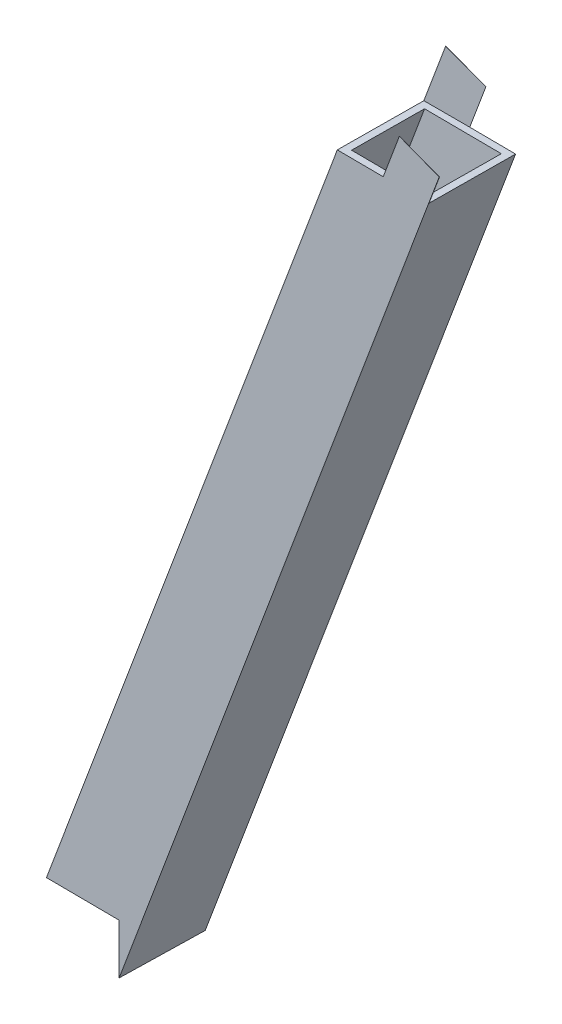
ISO-10303-21;
HEADER;
FILE_DESCRIPTION(('STEP AP214'),'2;1');
FILE_NAME('part.step','',(''),(''),'','','');
FILE_SCHEMA(('AUTOMOTIVE_DESIGN { 1 0 10303 214 1 1 1 1 }'));
ENDSEC;
DATA;
#1=APPLICATION_CONTEXT('core data for automotive mechanical design processes');
#2=APPLICATION_PROTOCOL_DEFINITION('international standard','automotive_design',2000,#1);
#3=PRODUCT_CONTEXT('',#1,'mechanical');
#4=PRODUCT('Part','Part','',(#3));
#5=PRODUCT_RELATED_PRODUCT_CATEGORY('part','',(#4));
#6=PRODUCT_DEFINITION_FORMATION('','',#4);
#7=PRODUCT_DEFINITION_CONTEXT('part definition',#1,'design');
#8=PRODUCT_DEFINITION('design','',#6,#7);
#9=PRODUCT_DEFINITION_SHAPE('','',#8);
#10=(LENGTH_UNIT() NAMED_UNIT(*) SI_UNIT(.MILLI.,.METRE.));
#11=(NAMED_UNIT(*) PLANE_ANGLE_UNIT() SI_UNIT($,.RADIAN.));
#12=(NAMED_UNIT(*) SI_UNIT($,.STERADIAN.) SOLID_ANGLE_UNIT());
#13=UNCERTAINTY_MEASURE_WITH_UNIT(LENGTH_MEASURE(1.E-05),#10,'distance_accuracy_value','');
#14=(GEOMETRIC_REPRESENTATION_CONTEXT(3) GLOBAL_UNCERTAINTY_ASSIGNED_CONTEXT((#13)) GLOBAL_UNIT_ASSIGNED_CONTEXT((#10,
#11,#12)) REPRESENTATION_CONTEXT('',''));
#15=CARTESIAN_POINT('',(0.,0.,0.));
#16=DIRECTION('',(0.,0.,1.));
#17=DIRECTION('',(1.,0.,0.));
#18=AXIS2_PLACEMENT_3D('',#15,#16,#17);
#19=CARTESIAN_POINT('',(232.803986578349,197.073505033119,-441.535165642863));
#20=DIRECTION('',(0.00725504842420271,-0.00272064315907602,-0.999969980736004));
#21=DIRECTION('',(-0.999973681595048,0.,-0.00725507527492033));
#22=AXIS2_PLACEMENT_3D('',#19,#20,#21);
#23=PLANE('',#22);
#24=DIRECTION('',(0.,0.999996298848739,-0.0027207147634189));
#25=VECTOR('',#24,1.);
#26=CARTESIAN_POINT('',(160.,197.072067923423,-442.063374037529));
#27=LINE('',#26,#25);
#28=CARTESIAN_POINT('',(160.,2.929540824187,-441.535165642863));
#29=VERTEX_POINT('',#28);
#30=CARTESIAN_POINT('',(160.,10.,-441.554402416725));
#31=VERTEX_POINT('',#30);
#32=EDGE_CURVE('E177',#29,#31,#27,.T.);
#33=ORIENTED_EDGE('',*,*,#32,.T.);
#34=DIRECTION('',(-0.999973681595048,0.,-0.00725507527492033));
#35=VECTOR('',#34,1.);
#36=CARTESIAN_POINT('',(232.800294019745,10.,-441.026216902576));
#37=LINE('',#36,#35);
#38=CARTESIAN_POINT('',(144.709552943641,10.,-441.665338680772));
#39=VERTEX_POINT('',#38);
#40=EDGE_CURVE('E180',#31,#39,#37,.T.);
#41=ORIENTED_EDGE('',*,*,#40,.T.);
#42=DIRECTION('',(-0.351123441588392,-0.936329177569044,0.));
#43=VECTOR('',#42,1.);
#44=CARTESIAN_POINT('',(217.074128608124,202.972201771954,-441.665338680772));
#45=LINE('',#44,#43);
#46=CARTESIAN_POINT('',(212.209552943641,190.,-441.665338680772));
#47=VERTEX_POINT('',#46);
#48=EDGE_CURVE('E45',#47,#39,#45,.T.);
#49=ORIENTED_EDGE('',*,*,#48,.F.);
#50=DIRECTION('',(0.999973681595048,0.,0.00725507527492033));
#51=VECTOR('',#50,1.);
#52=CARTESIAN_POINT('',(232.803846957659,190.,-441.515921595047));
#53=LINE('',#52,#51);
#54=CARTESIAN_POINT('',(230.15142219093,190.,-441.535165642863));
#55=VERTEX_POINT('',#54);
#56=EDGE_CURVE('E200',#47,#55,#53,.T.);
#57=ORIENTED_EDGE('',*,*,#56,.T.);
#58=DIRECTION('',(-0.351123441588392,-0.936329177569044,0.));
#59=VECTOR('',#58,1.);
#60=CARTESIAN_POINT('',(232.803986578349,197.073505033119,-441.535165642863));
#61=LINE('',#60,#59);
#62=EDGE_CURVE('E235',#55,#29,#61,.T.);
#63=ORIENTED_EDGE('',*,*,#62,.T.);
#64=EDGE_LOOP('',(#33,#41,#49,#57,#63));
#65=FACE_BOUND('',#64,.T.);
#66=ADVANCED_FACE('F41',(#65),#23,.T.);
#67=CARTESIAN_POINT('',(217.19601342165,202.926494966881,-458.464834357137));
#68=DIRECTION('',(0.936301069656275,-0.351112901121104,0.00774839511359631));
#69=DIRECTION('',(0.351123441588392,0.936329177569045,0.));
#70=AXIS2_PLACEMENT_3D('',#67,#68,#69);
#71=PLANE('',#70);
#72=ORIENTED_EDGE('',*,*,#48,.T.);
#73=DIRECTION('',(0.00827525467579562,0.,-0.999965759493819));
#74=VECTOR('',#73,1.);
#75=CARTESIAN_POINT('',(144.853532149881,10.,-459.063507312405));
#76=LINE('',#75,#74);
#77=CARTESIAN_POINT('',(144.84857780907,10.,-458.464834357137));
#78=VERTEX_POINT('',#77);
#79=EDGE_CURVE('E201',#39,#78,#76,.T.);
#80=ORIENTED_EDGE('',*,*,#79,.T.);
#81=DIRECTION('',(-0.351123441588392,-0.936329177569044,0.));
#82=VECTOR('',#81,1.);
#83=CARTESIAN_POINT('',(217.19601342165,202.926494966881,-458.464834357137));
#84=LINE('',#83,#82);
#85=CARTESIAN_POINT('',(212.348577809098,190.,-458.464834357137));
#86=VERTEX_POINT('',#85);
#87=EDGE_CURVE('E207',#86,#78,#84,.T.);
#88=ORIENTED_EDGE('',*,*,#87,.F.);
#89=DIRECTION('',(-0.00827525467579562,0.,0.999965759493819));
#90=VECTOR('',#89,1.);
#91=CARTESIAN_POINT('',(212.348909760685,190.,-458.50494674784));
#92=LINE('',#91,#90);
#93=EDGE_CURVE('E204',#86,#47,#92,.T.);
#94=ORIENTED_EDGE('',*,*,#93,.T.);
#95=EDGE_LOOP('',(#72,#80,#88,#94));
#96=FACE_BOUND('',#95,.T.);
#97=ADVANCED_FACE('F294',(#96),#71,.T.);
#98=CARTESIAN_POINT('',(232.925871391876,197.027798228047,-458.334661319229));
#99=DIRECTION('',(-0.00725504842420271,0.00272064315907602,0.999969980736004));
#100=DIRECTION('',(0.999973681595048,0.,0.00725507527492033));
#101=AXIS2_PLACEMENT_3D('',#98,#99,#100);
#102=PLANE('',#101);
#103=ORIENTED_EDGE('',*,*,#87,.T.);
#104=DIRECTION('',(0.999973681595048,0.,0.00725507527492033));
#105=VECTOR('',#104,1.);
#106=CARTESIAN_POINT('',(232.922179735458,10.,-457.825836928035));
#107=LINE('',#106,#105);
#108=CARTESIAN_POINT('',(160.,10.,-458.354906755501));
#109=VERTEX_POINT('',#108);
#110=EDGE_CURVE('E176',#78,#109,#107,.T.);
#111=ORIENTED_EDGE('',*,*,#110,.T.);
#112=DIRECTION('',(0.,-0.999996298848739,0.0027207147634189));
#113=VECTOR('',#112,1.);
#114=CARTESIAN_POINT('',(160.,197.026358712413,-458.863754014119));
#115=LINE('',#114,#113);
#116=CARTESIAN_POINT('',(160.,2.55880784971065,-458.334661319229));
#117=VERTEX_POINT('',#116);
#118=EDGE_CURVE('E172',#109,#117,#115,.T.);
#119=ORIENTED_EDGE('',*,*,#118,.T.);
#120=DIRECTION('',(-0.351123441588392,-0.936329177569044,0.));
#121=VECTOR('',#120,1.);
#122=CARTESIAN_POINT('',(232.925871391876,197.027798228047,-458.334661319229));
#123=LINE('',#122,#121);
#124=CARTESIAN_POINT('',(230.290447056358,190.,-458.334661319229));
#125=VERTEX_POINT('',#124);
#126=EDGE_CURVE('E193',#125,#117,#123,.T.);
#127=ORIENTED_EDGE('',*,*,#126,.F.);
#128=DIRECTION('',(-0.999973681595048,0.,-0.00725507527492033));
#129=VECTOR('',#128,1.);
#130=CARTESIAN_POINT('',(232.925732673372,190.,-458.315541620506));
#131=LINE('',#130,#129);
#132=EDGE_CURVE('E175',#125,#86,#131,.T.);
#133=ORIENTED_EDGE('',*,*,#132,.T.);
#134=EDGE_LOOP('',(#103,#111,#119,#127,#133));
#135=FACE_BOUND('',#134,.T.);
#136=ADVANCED_FACE('F300',(#135),#102,.T.);
#137=CARTESIAN_POINT('',(234.435561180805,196.461664557198,-459.922215856224));
#138=DIRECTION('',(-0.00725504842418489,0.00272064315906934,0.999969980736004));
#139=DIRECTION('',(0.999973681595049,0.,0.00725507527490251));
#140=AXIS2_PLACEMENT_3D('',#137,#138,#139);
#141=PLANE('',#140);
#142=DIRECTION('',(0.999973681595049,0.,0.00725507527490251));
#143=VECTOR('',#142,1.);
#144=CARTESIAN_POINT('',(234.431880699041,10.,-459.414931677894));
#145=LINE('',#144,#143);
#146=CARTESIAN_POINT('',(143.153068820321,10.,-460.077183758496));
#147=VERTEX_POINT('',#146);
#148=CARTESIAN_POINT('',(160.,10.,-459.954954787765));
#149=VERTEX_POINT('',#148);
#150=EDGE_CURVE('E51',#147,#149,#145,.T.);
#151=ORIENTED_EDGE('',*,*,#150,.F.);
#152=DIRECTION('',(-0.351123441588392,-0.936329177569044,0.));
#153=VECTOR('',#152,1.);
#154=CARTESIAN_POINT('',(215.709539787679,203.48392257962,-460.077183758496));
#155=LINE('',#154,#153);
#156=CARTESIAN_POINT('',(215.709539787679,203.48392257962,-460.077183758496));
#157=VERTEX_POINT('',#156);
#158=EDGE_CURVE('E220',#157,#147,#155,.T.);
#159=ORIENTED_EDGE('',*,*,#158,.F.);
#160=DIRECTION('',(-0.936301069656276,0.351112901121104,-0.00774839511358697));
#161=VECTOR('',#160,1.);
#162=CARTESIAN_POINT('',(234.435561180805,196.461664557198,-459.922215856224));
#163=LINE('',#162,#161);
#164=CARTESIAN_POINT('',(225.036275786601,199.986396580025,-460.));
#165=VERTEX_POINT('',#164);
#166=EDGE_CURVE('E217',#165,#157,#163,.T.);
#167=ORIENTED_EDGE('',*,*,#166,.F.);
#168=DIRECTION('',(0.351123441588392,0.936329177569044,0.));
#169=VECTOR('',#168,1.);
#170=CARTESIAN_POINT('',(225.036275786598,199.986396580026,-460.));
#171=LINE('',#170,#169);
#172=CARTESIAN_POINT('',(221.291377069089,190.,-460.));
#173=VERTEX_POINT('',#172);
#174=EDGE_CURVE('E155',#173,#165,#171,.T.);
#175=ORIENTED_EDGE('',*,*,#174,.F.);
#176=DIRECTION('',(-0.999973681595049,0.,-0.00725507527490251));
#177=VECTOR('',#176,1.);
#178=CARTESIAN_POINT('',(234.435433636955,190.,-459.904636370364));
#179=LINE('',#178,#177);
#180=CARTESIAN_POINT('',(232.01243697185,190.,-459.922215856224));
#181=VERTEX_POINT('',#180);
#182=EDGE_CURVE('E165',#181,#173,#179,.T.);
#183=ORIENTED_EDGE('',*,*,#182,.F.);
#184=DIRECTION('',(-0.351123441588392,-0.936329177569044,0.));
#185=VECTOR('',#184,1.);
#186=CARTESIAN_POINT('',(234.435561180805,196.461664557198,-459.922215856224));
#187=LINE('',#186,#185);
#188=CARTESIAN_POINT('',(160.,-2.03316525828102,-459.922215856224));
#189=VERTEX_POINT('',#188);
#190=EDGE_CURVE('E164',#181,#189,#187,.T.);
#191=ORIENTED_EDGE('',*,*,#190,.T.);
#192=DIRECTION('',(0.,-0.999996298848739,0.00272071476341222));
#193=VECTOR('',#192,1.);
#194=CARTESIAN_POINT('',(160.,196.460195241138,-460.462261671366));
#195=LINE('',#194,#193);
#196=EDGE_CURVE('E187',#149,#189,#195,.T.);
#197=ORIENTED_EDGE('',*,*,#196,.F.);
#198=EDGE_LOOP('',(#151,#159,#167,#175,#183,#191,#197));
#199=FACE_BOUND('',#198,.T.);
#200=ADVANCED_FACE('F267',(#199),#141,.F.);
#201=CARTESIAN_POINT('',(215.709539787679,203.48392257962,-460.077183758496));
#202=DIRECTION('',(0.936301069656275,-0.351112901121104,0.00774839511359747));
#203=DIRECTION('',(0.351123441588392,0.936329177569045,0.));
#204=AXIS2_PLACEMENT_3D('',#201,#202,#203);
#205=PLANE('',#204);
#206=DIRECTION('',(0.00827525467579686,0.,-0.999965759493819));
#207=VECTOR('',#206,1.);
#208=CARTESIAN_POINT('',(143.158037475841,10.,-460.677586475331));
#209=LINE('',#208,#207);
#210=CARTESIAN_POINT('',(142.987563028144,10.,-440.077784143776));
#211=VERTEX_POINT('',#210);
#212=EDGE_CURVE('E132',#211,#147,#209,.T.);
#213=ORIENTED_EDGE('',*,*,#212,.F.);
#214=DIRECTION('',(-0.351123441588392,-0.936329177569044,0.));
#215=VECTOR('',#214,1.);
#216=CARTESIAN_POINT('',(215.564438819195,203.538335442802,-440.077784143776));
#217=LINE('',#216,#215);
#218=CARTESIAN_POINT('',(210.487563028129,190.,-440.077784143776));
#219=VERTEX_POINT('',#218);
#220=EDGE_CURVE('E218',#219,#211,#217,.T.);
#221=ORIENTED_EDGE('',*,*,#220,.F.);
#222=DIRECTION('',(-0.00827525467579686,0.,0.999965759493819));
#223=VECTOR('',#222,1.);
#224=CARTESIAN_POINT('',(210.653415086644,190.,-460.119025910766));
#225=LINE('',#224,#223);
#226=CARTESIAN_POINT('',(210.652430083192,190.,-460.));
#227=VERTEX_POINT('',#226);
#228=EDGE_CURVE('E237',#227,#219,#225,.T.);
#229=ORIENTED_EDGE('',*,*,#228,.F.);
#230=DIRECTION('',(-0.351123441588392,-0.936329177569045,0.));
#231=VECTOR('',#230,1.);
#232=CARTESIAN_POINT('',(215.708979798963,203.484132575389,-460.));
#233=LINE('',#232,#231);
#234=CARTESIAN_POINT('',(215.708979798963,203.484132575389,-460.));
#235=VERTEX_POINT('',#234);
#236=EDGE_CURVE('E125',#235,#227,#233,.T.);
#237=ORIENTED_EDGE('',*,*,#236,.F.);
#238=DIRECTION('',(-0.00725504842419483,0.00272064315907273,0.999969980736004));
#239=VECTOR('',#238,1.);
#240=CARTESIAN_POINT('',(215.709539787679,203.48392257962,-460.077183758496));
#241=LINE('',#240,#239);
#242=EDGE_CURVE('E245',#157,#235,#241,.T.);
#243=ORIENTED_EDGE('',*,*,#242,.F.);
#244=ORIENTED_EDGE('',*,*,#158,.T.);
#245=EDGE_LOOP('',(#213,#221,#229,#237,#243,#244));
#246=FACE_BOUND('',#245,.T.);
#247=ADVANCED_FACE('F270',(#246),#205,.F.);
#248=CARTESIAN_POINT('',(234.290460212321,196.51607742038,-439.922816241504));
#249=DIRECTION('',(0.00725504842418489,-0.00272064315906934,-0.999969980736004));
#250=DIRECTION('',(-0.999973681595049,0.,-0.00725507527490251));
#251=AXIS2_PLACEMENT_3D('',#248,#249,#250);
#252=PLANE('',#251);
#253=DIRECTION('',(-0.999973681595049,0.,-0.00725507527490251));
#254=VECTOR('',#253,1.);
#255=CARTESIAN_POINT('',(234.286778656526,10.,-439.415384028538));
#256=LINE('',#255,#254);
#257=CARTESIAN_POINT('',(160.000000000002,10.,-439.954354384461));
#258=VERTEX_POINT('',#257);
#259=EDGE_CURVE('E211',#258,#211,#256,.T.);
#260=ORIENTED_EDGE('',*,*,#259,.F.);
#261=DIRECTION('',(0.,0.999996298848739,-0.00272071476341222));
#262=VECTOR('',#261,1.);
#263=CARTESIAN_POINT('',(160.,196.514610968531,-440.461809318283));
#264=LINE('',#263,#262);
#265=CARTESIAN_POINT('',(160.,-1.59181647912707,-439.922816241504));
#266=VERTEX_POINT('',#265);
#267=EDGE_CURVE('E181',#266,#258,#264,.T.);
#268=ORIENTED_EDGE('',*,*,#267,.F.);
#269=DIRECTION('',(-0.351123441588392,-0.936329177569044,0.));
#270=VECTOR('',#269,1.);
#271=CARTESIAN_POINT('',(234.290460212321,196.51607742038,-439.922816241504));
#272=LINE('',#271,#270);
#273=CARTESIAN_POINT('',(234.290460212321,196.51607742038,-439.922816241504));
#274=VERTEX_POINT('',#273);
#275=EDGE_CURVE('E197',#274,#266,#272,.T.);
#276=ORIENTED_EDGE('',*,*,#275,.F.);
#277=DIRECTION('',(0.936301069656276,-0.351112901121103,0.00774839511358697));
#278=VECTOR('',#277,1.);
#279=CARTESIAN_POINT('',(234.290460212321,196.51607742038,-439.922816241504));
#280=LINE('',#279,#278);
#281=CARTESIAN_POINT('',(224.963724213408,200.013603419972,-440.));
#282=VERTEX_POINT('',#281);
#283=EDGE_CURVE('E242',#282,#274,#280,.T.);
#284=ORIENTED_EDGE('',*,*,#283,.F.);
#285=DIRECTION('',(0.351123441588392,0.936329177569044,0.));
#286=VECTOR('',#285,1.);
#287=CARTESIAN_POINT('',(224.963724213412,200.01360341997,-440.));
#288=LINE('',#287,#286);
#289=CARTESIAN_POINT('',(221.208622930885,190.,-440.));
#290=VERTEX_POINT('',#289);
#291=EDGE_CURVE('E144',#290,#282,#288,.T.);
#292=ORIENTED_EDGE('',*,*,#291,.F.);
#293=DIRECTION('',(0.999973681595049,0.,0.00725507527490251));
#294=VECTOR('',#293,1.);
#295=CARTESIAN_POINT('',(234.29033159444,190.,-439.905088721008));
#296=LINE('',#295,#294);
#297=EDGE_CURVE('E60',#219,#290,#296,.T.);
#298=ORIENTED_EDGE('',*,*,#297,.F.);
#299=ORIENTED_EDGE('',*,*,#220,.T.);
#300=EDGE_LOOP('',(#260,#268,#276,#284,#292,#298,#299));
#301=FACE_BOUND('',#300,.T.);
#302=ADVANCED_FACE('F275',(#301),#252,.F.);
#303=CARTESIAN_POINT('',(234.435561180805,196.461664557198,-459.922215856224));
#304=DIRECTION('',(-0.936301069656275,0.351112901121104,-0.00774839511359616));
#305=DIRECTION('',(-0.351123441588392,-0.936329177569045,0.));
#306=AXIS2_PLACEMENT_3D('',#303,#304,#305);
#307=PLANE('',#306);
#308=DIRECTION('',(-0.351123441588392,-0.936329177569045,0.));
#309=VECTOR('',#308,1.);
#310=CARTESIAN_POINT('',(234.291020201037,196.515867424611,-440.));
#311=LINE('',#310,#309);
#312=CARTESIAN_POINT('',(234.291020201037,196.515867424611,-440.));
#313=VERTEX_POINT('',#312);
#314=CARTESIAN_POINT('',(231.847569916807,190.,-440.));
#315=VERTEX_POINT('',#314);
#316=EDGE_CURVE('E147',#313,#315,#311,.T.);
#317=ORIENTED_EDGE('',*,*,#316,.F.);
#318=DIRECTION('',(0.00725504842419344,-0.00272064315907271,-0.999969980736004));
#319=VECTOR('',#318,1.);
#320=CARTESIAN_POINT('',(234.435561180805,196.461664557198,-459.922215856224));
#321=LINE('',#320,#319);
#322=EDGE_CURVE('E236',#274,#313,#321,.T.);
#323=ORIENTED_EDGE('',*,*,#322,.F.);
#324=ORIENTED_EDGE('',*,*,#275,.T.);
#325=DIRECTION('',(0.,0.0220627297921587,0.999756588352444));
#326=VECTOR('',#325,1.);
#327=CARTESIAN_POINT('',(160.,-1.93654511183342,-455.543944042693));
#328=LINE('',#327,#326);
#329=EDGE_CURVE('E184',#189,#266,#328,.T.);
#330=ORIENTED_EDGE('',*,*,#329,.F.);
#331=ORIENTED_EDGE('',*,*,#190,.F.);
#332=DIRECTION('',(0.00827525467579546,0.,-0.999965759493819));
#333=VECTOR('',#332,1.);
#334=CARTESIAN_POINT('',(232.012602907013,190.,-459.942267139575));
#335=LINE('',#334,#333);
#336=EDGE_CURVE('E158',#315,#181,#335,.T.);
#337=ORIENTED_EDGE('',*,*,#336,.F.);
#338=EDGE_LOOP('',(#317,#323,#324,#330,#331,#337));
#339=FACE_BOUND('',#338,.T.);
#340=ADVANCED_FACE('F162',(#339),#307,.F.);
#341=CARTESIAN_POINT('',(232.925871391876,197.027798228047,-458.334661319229));
#342=DIRECTION('',(-0.936301069656275,0.351112901121104,-0.00774839511359631));
#343=DIRECTION('',(-0.351123441588392,-0.936329177569045,0.));
#344=AXIS2_PLACEMENT_3D('',#341,#342,#343);
#345=PLANE('',#344);
#346=ORIENTED_EDGE('',*,*,#62,.F.);
#347=DIRECTION('',(0.00827525467579562,0.,-0.999965759493819));
#348=VECTOR('',#347,1.);
#349=CARTESIAN_POINT('',(230.290627529795,190.,-458.356469380039));
#350=LINE('',#349,#348);
#351=EDGE_CURVE('E194',#55,#125,#350,.T.);
#352=ORIENTED_EDGE('',*,*,#351,.T.);
#353=ORIENTED_EDGE('',*,*,#126,.T.);
#354=DIRECTION('',(0.,0.0220627297921592,0.999756588352444));
#355=VECTOR('',#354,1.);
#356=CARTESIAN_POINT('',(160.,2.65346836226577,-454.045188893317));
#357=LINE('',#356,#355);
#358=EDGE_CURVE('E190',#117,#29,#357,.T.);
#359=ORIENTED_EDGE('',*,*,#358,.T.);
#360=EDGE_LOOP('',(#346,#352,#353,#359));
#361=FACE_BOUND('',#360,.T.);
#362=ADVANCED_FACE('F312',(#361),#345,.T.);
#363=CARTESIAN_POINT('',(160.,-10.,-450.));
#364=DIRECTION('',(-1.,0.,0.));
#365=DIRECTION('',(0.,0.,1.));
#366=AXIS2_PLACEMENT_3D('',#363,#364,#365);
#367=PLANE('',#366);
#368=ORIENTED_EDGE('',*,*,#196,.T.);
#369=ORIENTED_EDGE('',*,*,#329,.T.);
#370=ORIENTED_EDGE('',*,*,#267,.T.);
#371=DIRECTION('',(0.,0.,1.));
#372=VECTOR('',#371,1.);
#373=CARTESIAN_POINT('',(160.,10.,-450.));
#374=LINE('',#373,#372);
#375=EDGE_CURVE('E213',#31,#258,#374,.T.);
#376=ORIENTED_EDGE('',*,*,#375,.F.);
#377=ORIENTED_EDGE('',*,*,#32,.F.);
#378=ORIENTED_EDGE('',*,*,#358,.F.);
#379=ORIENTED_EDGE('',*,*,#118,.F.);
#380=DIRECTION('',(0.,0.,1.));
#381=VECTOR('',#380,1.);
#382=CARTESIAN_POINT('',(160.,10.,-450.));
#383=LINE('',#382,#381);
#384=EDGE_CURVE('E11',#149,#109,#383,.T.);
#385=ORIENTED_EDGE('',*,*,#384,.F.);
#386=EDGE_LOOP('',(#368,#369,#370,#376,#377,#378,#379,#385));
#387=FACE_BOUND('',#386,.T.);
#388=ADVANCED_FACE('F278',(#387),#367,.T.);
#389=CARTESIAN_POINT('',(225.,190.,-460.));
#390=DIRECTION('',(0.,0.,1.));
#391=DIRECTION('',(1.,0.,0.));
#392=AXIS2_PLACEMENT_3D('',#389,#390,#391);
#393=PLANE('',#392);
#394=DIRECTION('',(0.936329177569045,-0.351123441588391,0.));
#395=VECTOR('',#394,1.);
#396=CARTESIAN_POINT('',(228.287671232877,198.767123287671,-460.));
#397=LINE('',#396,#395);
#398=EDGE_CURVE('E248',#235,#165,#397,.T.);
#399=ORIENTED_EDGE('',*,*,#398,.F.);
#400=ORIENTED_EDGE('',*,*,#236,.T.);
#401=DIRECTION('',(-1.,0.,0.));
#402=VECTOR('',#401,1.);
#403=CARTESIAN_POINT('',(225.,190.,-460.));
#404=LINE('',#403,#402);
#405=EDGE_CURVE('E167',#173,#227,#404,.T.);
#406=ORIENTED_EDGE('',*,*,#405,.F.);
#407=ORIENTED_EDGE('',*,*,#174,.T.);
#408=EDGE_LOOP('',(#399,#400,#406,#407));
#409=FACE_BOUND('',#408,.T.);
#410=ADVANCED_FACE('F263',(#409),#393,.T.);
#411=CARTESIAN_POINT('',(225.,190.,-440.));
#412=DIRECTION('',(0.,0.,-1.));
#413=DIRECTION('',(-1.,0.,0.));
#414=AXIS2_PLACEMENT_3D('',#411,#412,#413);
#415=PLANE('',#414);
#416=DIRECTION('',(-0.936329177569045,0.351123441588391,0.));
#417=VECTOR('',#416,1.);
#418=CARTESIAN_POINT('',(228.287671232877,198.767123287671,-440.));
#419=LINE('',#418,#417);
#420=EDGE_CURVE('E151',#313,#282,#419,.T.);
#421=ORIENTED_EDGE('',*,*,#420,.F.);
#422=ORIENTED_EDGE('',*,*,#316,.T.);
#423=DIRECTION('',(-1.,0.,0.));
#424=VECTOR('',#423,1.);
#425=CARTESIAN_POINT('',(225.,190.,-440.));
#426=LINE('',#425,#424);
#427=EDGE_CURVE('E149',#315,#290,#426,.T.);
#428=ORIENTED_EDGE('',*,*,#427,.T.);
#429=ORIENTED_EDGE('',*,*,#291,.T.);
#430=EDGE_LOOP('',(#421,#422,#428,#429));
#431=FACE_BOUND('',#430,.T.);
#432=ADVANCED_FACE('F148',(#431),#415,.T.);
#433=CARTESIAN_POINT('',(225.,190.,-460.));
#434=DIRECTION('',(0.,1.,0.));
#435=DIRECTION('',(0.,0.,1.));
#436=AXIS2_PLACEMENT_3D('',#433,#434,#435);
#437=PLANE('',#436);
#438=ORIENTED_EDGE('',*,*,#93,.F.);
#439=ORIENTED_EDGE('',*,*,#132,.F.);
#440=ORIENTED_EDGE('',*,*,#351,.F.);
#441=ORIENTED_EDGE('',*,*,#56,.F.);
#442=EDGE_LOOP('',(#438,#439,#440,#441));
#443=FACE_BOUND('',#442,.T.);
#444=ORIENTED_EDGE('',*,*,#336,.T.);
#445=ORIENTED_EDGE('',*,*,#182,.T.);
#446=ORIENTED_EDGE('',*,*,#405,.T.);
#447=ORIENTED_EDGE('',*,*,#228,.T.);
#448=ORIENTED_EDGE('',*,*,#297,.T.);
#449=ORIENTED_EDGE('',*,*,#427,.F.);
#450=EDGE_LOOP('',(#444,#445,#446,#447,#448,#449));
#451=FACE_BOUND('',#450,.T.);
#452=ADVANCED_FACE('F157',(#443,#451),#437,.T.);
#453=CARTESIAN_POINT('',(59.8106354721447,261.946011697946,1849.19802051315));
#454=DIRECTION('',(-0.351123441588391,-0.936329177569045,0.));
#455=DIRECTION('',(0.93631888380911,-0.351119581428416,0.00468906813722364));
#456=AXIS2_PLACEMENT_3D('',#453,#454,#455);
#457=PLANE('',#456);
#458=ORIENTED_EDGE('',*,*,#322,.T.);
#459=ORIENTED_EDGE('',*,*,#420,.T.);
#460=ORIENTED_EDGE('',*,*,#283,.T.);
#461=EDGE_LOOP('',(#458,#459,#460));
#462=FACE_BOUND('',#461,.T.);
#463=ADVANCED_FACE('F282',(#462),#457,.F.);
#464=ORIENTED_EDGE('',*,*,#242,.T.);
#465=ORIENTED_EDGE('',*,*,#398,.T.);
#466=ORIENTED_EDGE('',*,*,#166,.T.);
#467=EDGE_LOOP('',(#464,#465,#466));
#468=FACE_BOUND('',#467,.T.);
#469=ADVANCED_FACE('F269',(#468),#457,.F.);
#470=CARTESIAN_POINT('',(140.,10.,-450.));
#471=DIRECTION('',(0.,-1.,0.));
#472=DIRECTION('',(0.,0.,-1.));
#473=AXIS2_PLACEMENT_3D('',#470,#471,#472);
#474=PLANE('',#473);
#475=ORIENTED_EDGE('',*,*,#375,.T.);
#476=ORIENTED_EDGE('',*,*,#259,.T.);
#477=ORIENTED_EDGE('',*,*,#212,.T.);
#478=ORIENTED_EDGE('',*,*,#150,.T.);
#479=ORIENTED_EDGE('',*,*,#384,.T.);
#480=ORIENTED_EDGE('',*,*,#110,.F.);
#481=ORIENTED_EDGE('',*,*,#79,.F.);
#482=ORIENTED_EDGE('',*,*,#40,.F.);
#483=EDGE_LOOP('',(#475,#476,#477,#478,#479,#480,#481,#482));
#484=FACE_BOUND('',#483,.T.);
#485=ADVANCED_FACE('F43',(#484),#474,.T.);
#486=CLOSED_SHELL('',(#66,#97,#136,#200,#247,#302,#340,#362,#388,#410,#432,#452,#463,#469,#485));
#487=MANIFOLD_SOLID_BREP('B2',#486);
#488=ADVANCED_BREP_SHAPE_REPRESENTATION('',(#18,#487),#14);
#489=SHAPE_DEFINITION_REPRESENTATION(#9,#488);
ENDSEC;
END-ISO-10303-21;
